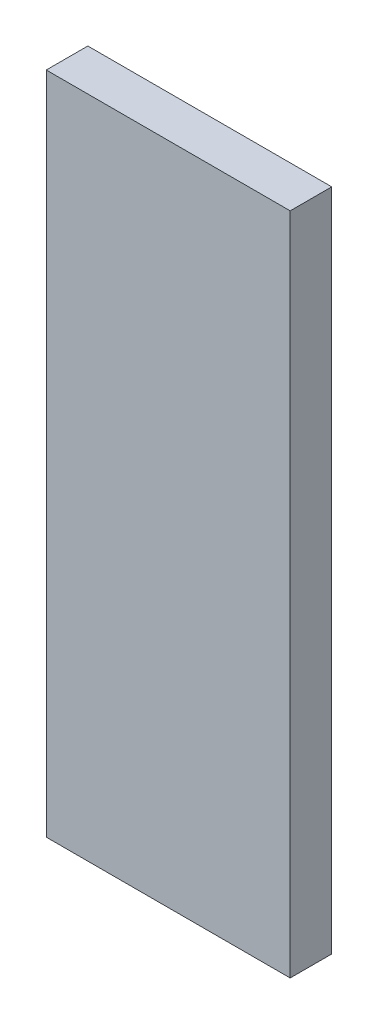
ISO-10303-21;
HEADER;
FILE_DESCRIPTION(('STEP AP214'),'2;1');
FILE_NAME('part.step','',(''),(''),'','','');
FILE_SCHEMA(('AUTOMOTIVE_DESIGN { 1 0 10303 214 1 1 1 1 }'));
ENDSEC;
DATA;
#1=APPLICATION_CONTEXT('core data for automotive mechanical design processes');
#2=APPLICATION_PROTOCOL_DEFINITION('international standard','automotive_design',2000,#1);
#3=PRODUCT_CONTEXT('',#1,'mechanical');
#4=PRODUCT('Part','Part','',(#3));
#5=PRODUCT_RELATED_PRODUCT_CATEGORY('part','',(#4));
#6=PRODUCT_DEFINITION_FORMATION('','',#4);
#7=PRODUCT_DEFINITION_CONTEXT('part definition',#1,'design');
#8=PRODUCT_DEFINITION('design','',#6,#7);
#9=PRODUCT_DEFINITION_SHAPE('','',#8);
#10=(LENGTH_UNIT() NAMED_UNIT(*) SI_UNIT(.MILLI.,.METRE.));
#11=(NAMED_UNIT(*) PLANE_ANGLE_UNIT() SI_UNIT($,.RADIAN.));
#12=(NAMED_UNIT(*) SI_UNIT($,.STERADIAN.) SOLID_ANGLE_UNIT());
#13=UNCERTAINTY_MEASURE_WITH_UNIT(LENGTH_MEASURE(1.E-05),#10,'distance_accuracy_value','');
#14=(GEOMETRIC_REPRESENTATION_CONTEXT(3) GLOBAL_UNCERTAINTY_ASSIGNED_CONTEXT((#13)) GLOBAL_UNIT_ASSIGNED_CONTEXT((#10,
#11,#12)) REPRESENTATION_CONTEXT('',''));
#15=CARTESIAN_POINT('',(0.,0.,0.));
#16=DIRECTION('',(0.,0.,1.));
#17=DIRECTION('',(1.,0.,0.));
#18=AXIS2_PLACEMENT_3D('',#15,#16,#17);
#19=CARTESIAN_POINT('',(0.67499992,-1.8386044,0.));
#20=DIRECTION('',(-1.,0.,0.));
#21=DIRECTION('',(0.,1.,0.));
#22=AXIS2_PLACEMENT_3D('',#19,#20,#21);
#23=PLANE('',#22);
#24=DIRECTION('',(0.,1.,0.));
#25=VECTOR('',#24,1.);
#26=CARTESIAN_POINT('',(0.67499992,-1.8386044,0.));
#27=LINE('',#26,#25);
#28=CARTESIAN_POINT('',(0.67499992,-1.8386044,0.));
#29=VERTEX_POINT('',#28);
#30=CARTESIAN_POINT('',(0.67499992,1.8386044,0.));
#31=VERTEX_POINT('',#30);
#32=EDGE_CURVE('E11',#29,#31,#27,.T.);
#33=ORIENTED_EDGE('',*,*,#32,.T.);
#34=DIRECTION('',(0.,0.,1.));
#35=VECTOR('',#34,1.);
#36=CARTESIAN_POINT('',(0.67499992,1.8386044,0.));
#37=LINE('',#36,#35);
#38=CARTESIAN_POINT('',(0.67499992,1.8386044,0.22999954));
#39=VERTEX_POINT('',#38);
#40=EDGE_CURVE('E24',#31,#39,#37,.T.);
#41=ORIENTED_EDGE('',*,*,#40,.T.);
#42=DIRECTION('',(0.,1.,0.));
#43=VECTOR('',#42,1.);
#44=CARTESIAN_POINT('',(0.67499992,-1.8386044,0.22999954));
#45=LINE('',#44,#43);
#46=CARTESIAN_POINT('',(0.67499992,-1.8386044,0.22999954));
#47=VERTEX_POINT('',#46);
#48=EDGE_CURVE('E87',#47,#39,#45,.T.);
#49=ORIENTED_EDGE('',*,*,#48,.F.);
#50=DIRECTION('',(0.,0.,1.));
#51=VECTOR('',#50,1.);
#52=CARTESIAN_POINT('',(0.67499992,-1.8386044,0.));
#53=LINE('',#52,#51);
#54=EDGE_CURVE('E36',#29,#47,#53,.T.);
#55=ORIENTED_EDGE('',*,*,#54,.F.);
#56=EDGE_LOOP('',(#33,#41,#49,#55));
#57=FACE_BOUND('',#56,.T.);
#58=ADVANCED_FACE('F17',(#57),#23,.F.);
#59=CARTESIAN_POINT('',(0.67499992,1.8386044,0.));
#60=DIRECTION('',(0.,-1.,0.));
#61=DIRECTION('',(-1.,0.,0.));
#62=AXIS2_PLACEMENT_3D('',#59,#60,#61);
#63=PLANE('',#62);
#64=DIRECTION('',(-1.,0.,0.));
#65=VECTOR('',#64,1.);
#66=CARTESIAN_POINT('',(0.67499992,1.8386044,0.));
#67=LINE('',#66,#65);
#68=CARTESIAN_POINT('',(-0.67499992,1.8386044,0.));
#69=VERTEX_POINT('',#68);
#70=EDGE_CURVE('E84',#31,#69,#67,.T.);
#71=ORIENTED_EDGE('',*,*,#70,.T.);
#72=DIRECTION('',(0.,0.,1.));
#73=VECTOR('',#72,1.);
#74=CARTESIAN_POINT('',(-0.67499992,1.8386044,0.));
#75=LINE('',#74,#73);
#76=CARTESIAN_POINT('',(-0.67499992,1.8386044,0.22999954));
#77=VERTEX_POINT('',#76);
#78=EDGE_CURVE('E82',#69,#77,#75,.T.);
#79=ORIENTED_EDGE('',*,*,#78,.T.);
#80=DIRECTION('',(-1.,0.,0.));
#81=VECTOR('',#80,1.);
#82=CARTESIAN_POINT('',(0.67499992,1.8386044,0.22999954));
#83=LINE('',#82,#81);
#84=EDGE_CURVE('E62',#39,#77,#83,.T.);
#85=ORIENTED_EDGE('',*,*,#84,.F.);
#86=ORIENTED_EDGE('',*,*,#40,.F.);
#87=EDGE_LOOP('',(#71,#79,#85,#86));
#88=FACE_BOUND('',#87,.T.);
#89=ADVANCED_FACE('F89',(#88),#63,.F.);
#90=CARTESIAN_POINT('',(-0.67499992,1.8386044,0.));
#91=DIRECTION('',(1.,0.,0.));
#92=DIRECTION('',(0.,-1.,0.));
#93=AXIS2_PLACEMENT_3D('',#90,#91,#92);
#94=PLANE('',#93);
#95=DIRECTION('',(0.,-1.,0.));
#96=VECTOR('',#95,1.);
#97=CARTESIAN_POINT('',(-0.67499992,1.8386044,0.));
#98=LINE('',#97,#96);
#99=CARTESIAN_POINT('',(-0.67499992,-1.8386044,0.));
#100=VERTEX_POINT('',#99);
#101=EDGE_CURVE('E71',#69,#100,#98,.T.);
#102=ORIENTED_EDGE('',*,*,#101,.T.);
#103=DIRECTION('',(0.,0.,1.));
#104=VECTOR('',#103,1.);
#105=CARTESIAN_POINT('',(-0.67499992,-1.8386044,0.));
#106=LINE('',#105,#104);
#107=CARTESIAN_POINT('',(-0.67499992,-1.8386044,0.22999954));
#108=VERTEX_POINT('',#107);
#109=EDGE_CURVE('E65',#100,#108,#106,.T.);
#110=ORIENTED_EDGE('',*,*,#109,.T.);
#111=DIRECTION('',(0.,-1.,0.));
#112=VECTOR('',#111,1.);
#113=CARTESIAN_POINT('',(-0.67499992,1.8386044,0.22999954));
#114=LINE('',#113,#112);
#115=EDGE_CURVE('E57',#77,#108,#114,.T.);
#116=ORIENTED_EDGE('',*,*,#115,.F.);
#117=ORIENTED_EDGE('',*,*,#78,.F.);
#118=EDGE_LOOP('',(#102,#110,#116,#117));
#119=FACE_BOUND('',#118,.T.);
#120=ADVANCED_FACE('F69',(#119),#94,.F.);
#121=CARTESIAN_POINT('',(-0.67499992,-1.8386044,0.));
#122=DIRECTION('',(0.,1.,0.));
#123=DIRECTION('',(1.,0.,0.));
#124=AXIS2_PLACEMENT_3D('',#121,#122,#123);
#125=PLANE('',#124);
#126=DIRECTION('',(1.,0.,0.));
#127=VECTOR('',#126,1.);
#128=CARTESIAN_POINT('',(-0.67499992,-1.8386044,0.));
#129=LINE('',#128,#127);
#130=EDGE_CURVE('E66',#100,#29,#129,.T.);
#131=ORIENTED_EDGE('',*,*,#130,.T.);
#132=ORIENTED_EDGE('',*,*,#54,.T.);
#133=DIRECTION('',(1.,0.,0.));
#134=VECTOR('',#133,1.);
#135=CARTESIAN_POINT('',(-0.67499992,-1.8386044,0.22999954));
#136=LINE('',#135,#134);
#137=EDGE_CURVE('E61',#108,#47,#136,.T.);
#138=ORIENTED_EDGE('',*,*,#137,.F.);
#139=ORIENTED_EDGE('',*,*,#109,.F.);
#140=EDGE_LOOP('',(#131,#132,#138,#139));
#141=FACE_BOUND('',#140,.T.);
#142=ADVANCED_FACE('F76',(#141),#125,.F.);
#143=CARTESIAN_POINT('',(0.,0.,0.));
#144=DIRECTION('',(0.,0.,1.));
#145=DIRECTION('',(1.,0.,0.));
#146=AXIS2_PLACEMENT_3D('',#143,#144,#145);
#147=PLANE('',#146);
#148=ORIENTED_EDGE('',*,*,#130,.F.);
#149=ORIENTED_EDGE('',*,*,#101,.F.);
#150=ORIENTED_EDGE('',*,*,#70,.F.);
#151=ORIENTED_EDGE('',*,*,#32,.F.);
#152=EDGE_LOOP('',(#148,#149,#150,#151));
#153=FACE_BOUND('',#152,.T.);
#154=ADVANCED_FACE('F91',(#153),#147,.F.);
#155=CARTESIAN_POINT('',(0.,0.,0.22999954));
#156=DIRECTION('',(0.,0.,1.));
#157=DIRECTION('',(1.,0.,0.));
#158=AXIS2_PLACEMENT_3D('',#155,#156,#157);
#159=PLANE('',#158);
#160=ORIENTED_EDGE('',*,*,#48,.T.);
#161=ORIENTED_EDGE('',*,*,#84,.T.);
#162=ORIENTED_EDGE('',*,*,#115,.T.);
#163=ORIENTED_EDGE('',*,*,#137,.T.);
#164=EDGE_LOOP('',(#160,#161,#162,#163));
#165=FACE_BOUND('',#164,.T.);
#166=ADVANCED_FACE('F59',(#165),#159,.T.);
#167=CLOSED_SHELL('',(#58,#89,#120,#142,#154,#166));
#168=MANIFOLD_SOLID_BREP('B1',#167);
#169=ADVANCED_BREP_SHAPE_REPRESENTATION('',(#18,#168),#14);
#170=SHAPE_DEFINITION_REPRESENTATION(#9,#169);
ENDSEC;
END-ISO-10303-21;
